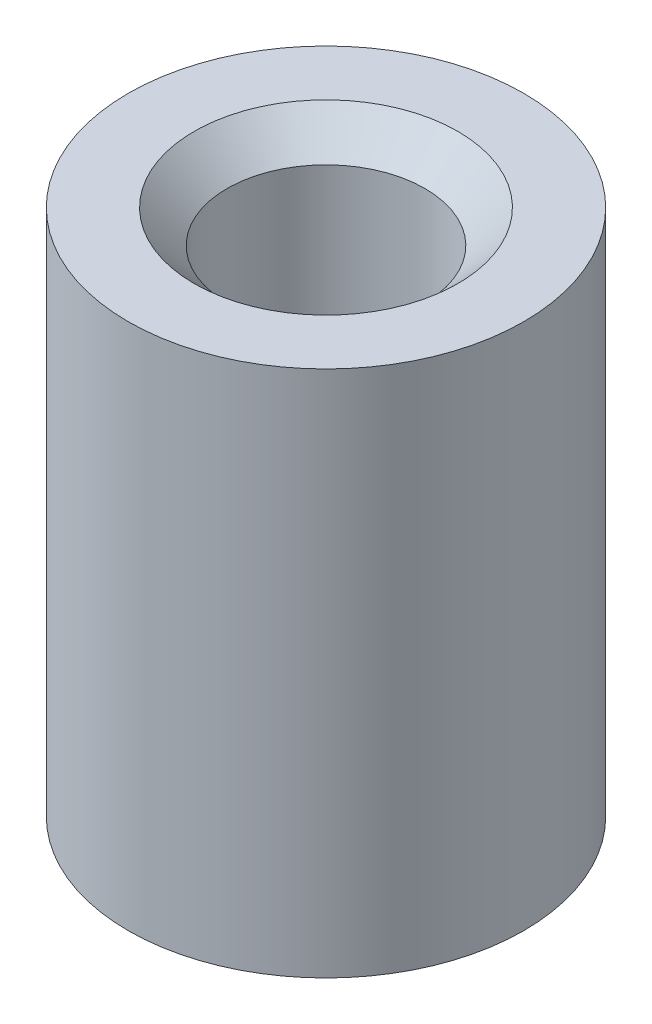
ISO-10303-21;
HEADER;
FILE_DESCRIPTION(('STEP AP214'),'2;1');
FILE_NAME('part.step','',(''),(''),'','','');
FILE_SCHEMA(('AUTOMOTIVE_DESIGN { 1 0 10303 214 1 1 1 1 }'));
ENDSEC;
DATA;
#1=APPLICATION_CONTEXT('core data for automotive mechanical design processes');
#2=APPLICATION_PROTOCOL_DEFINITION('international standard','automotive_design',2000,#1);
#3=PRODUCT_CONTEXT('',#1,'mechanical');
#4=PRODUCT('Part','Part','',(#3));
#5=PRODUCT_RELATED_PRODUCT_CATEGORY('part','',(#4));
#6=PRODUCT_DEFINITION_FORMATION('','',#4);
#7=PRODUCT_DEFINITION_CONTEXT('part definition',#1,'design');
#8=PRODUCT_DEFINITION('design','',#6,#7);
#9=PRODUCT_DEFINITION_SHAPE('','',#8);
#10=(LENGTH_UNIT() NAMED_UNIT(*) SI_UNIT(.MILLI.,.METRE.));
#11=(NAMED_UNIT(*) PLANE_ANGLE_UNIT() SI_UNIT($,.RADIAN.));
#12=(NAMED_UNIT(*) SI_UNIT($,.STERADIAN.) SOLID_ANGLE_UNIT());
#13=UNCERTAINTY_MEASURE_WITH_UNIT(LENGTH_MEASURE(1.E-05),#10,'distance_accuracy_value','');
#14=(GEOMETRIC_REPRESENTATION_CONTEXT(3) GLOBAL_UNCERTAINTY_ASSIGNED_CONTEXT((#13)) GLOBAL_UNIT_ASSIGNED_CONTEXT((#10,
#11,#12)) REPRESENTATION_CONTEXT('',''));
#15=CARTESIAN_POINT('',(0.,0.,0.));
#16=DIRECTION('',(0.,0.,1.));
#17=DIRECTION('',(1.,0.,0.));
#18=AXIS2_PLACEMENT_3D('',#15,#16,#17);
#19=CARTESIAN_POINT('',(0.,16.,0.));
#20=DIRECTION('',(0.,-1.,0.));
#21=DIRECTION('',(0.,0.,-1.));
#22=AXIS2_PLACEMENT_3D('',#19,#20,#21);
#23=PLANE('',#22);
#24=CARTESIAN_POINT('',(0.,16.,0.));
#25=DIRECTION('',(0.,-1.,0.));
#26=DIRECTION('',(0.,0.,-1.));
#27=AXIS2_PLACEMENT_3D('',#24,#25,#26);
#28=CIRCLE('',#27,4.);
#29=CARTESIAN_POINT('',(0.,16.,-4.));
#30=VERTEX_POINT('',#29);
#31=EDGE_CURVE('E54',#30,#30,#28,.T.);
#32=ORIENTED_EDGE('',*,*,#31,.T.);
#33=EDGE_LOOP('',(#32));
#34=FACE_BOUND('',#33,.T.);
#35=CARTESIAN_POINT('',(0.,16.,0.));
#36=DIRECTION('',(0.,-1.,0.));
#37=DIRECTION('',(0.,0.,-1.));
#38=AXIS2_PLACEMENT_3D('',#35,#36,#37);
#39=CIRCLE('',#38,6.);
#40=CARTESIAN_POINT('',(0.,16.,-6.));
#41=VERTEX_POINT('',#40);
#42=EDGE_CURVE('E70',#41,#41,#39,.T.);
#43=ORIENTED_EDGE('',*,*,#42,.F.);
#44=EDGE_LOOP('',(#43));
#45=FACE_BOUND('',#44,.T.);
#46=ADVANCED_FACE('F45',(#34,#45),#23,.F.);
#47=CARTESIAN_POINT('',(0.,0.,0.));
#48=DIRECTION('',(0.,-1.,0.));
#49=DIRECTION('',(0.,0.,-1.));
#50=AXIS2_PLACEMENT_3D('',#47,#48,#49);
#51=CYLINDRICAL_SURFACE('',#50,3.);
#52=CARTESIAN_POINT('',(0.,15.,0.));
#53=DIRECTION('',(0.,-1.,0.));
#54=DIRECTION('',(0.,0.,-1.));
#55=AXIS2_PLACEMENT_3D('',#52,#53,#54);
#56=CIRCLE('',#55,3.);
#57=CARTESIAN_POINT('',(0.,15.,-3.));
#58=VERTEX_POINT('',#57);
#59=EDGE_CURVE('E10',#58,#58,#56,.F.);
#60=ORIENTED_EDGE('',*,*,#59,.T.);
#61=EDGE_LOOP('',(#60));
#62=FACE_BOUND('',#61,.T.);
#63=CARTESIAN_POINT('',(0.,0.,0.));
#64=DIRECTION('',(0.,-1.,0.));
#65=DIRECTION('',(0.,0.,-1.));
#66=AXIS2_PLACEMENT_3D('',#63,#64,#65);
#67=CIRCLE('',#66,3.);
#68=CARTESIAN_POINT('',(0.,0.,-3.));
#69=VERTEX_POINT('',#68);
#70=EDGE_CURVE('E59',#69,#69,#67,.T.);
#71=ORIENTED_EDGE('',*,*,#70,.T.);
#72=EDGE_LOOP('',(#71));
#73=FACE_BOUND('',#72,.T.);
#74=ADVANCED_FACE('F78',(#62,#73),#51,.F.);
#75=CARTESIAN_POINT('',(0.,0.,0.));
#76=DIRECTION('',(0.,1.,0.));
#77=DIRECTION('',(0.,0.,1.));
#78=AXIS2_PLACEMENT_3D('',#75,#76,#77);
#79=PLANE('',#78);
#80=ORIENTED_EDGE('',*,*,#70,.F.);
#81=EDGE_LOOP('',(#80));
#82=FACE_BOUND('',#81,.T.);
#83=CARTESIAN_POINT('',(0.,0.,0.));
#84=DIRECTION('',(0.,-1.,0.));
#85=DIRECTION('',(0.,0.,-1.));
#86=AXIS2_PLACEMENT_3D('',#83,#84,#85);
#87=CIRCLE('',#86,6.);
#88=CARTESIAN_POINT('',(0.,0.,-6.));
#89=VERTEX_POINT('',#88);
#90=EDGE_CURVE('E64',#89,#89,#87,.T.);
#91=ORIENTED_EDGE('',*,*,#90,.T.);
#92=EDGE_LOOP('',(#91));
#93=FACE_BOUND('',#92,.T.);
#94=ADVANCED_FACE('F83',(#82,#93),#79,.F.);
#95=CARTESIAN_POINT('',(0.,0.,0.));
#96=DIRECTION('',(0.,-1.,0.));
#97=DIRECTION('',(0.,0.,-1.));
#98=AXIS2_PLACEMENT_3D('',#95,#96,#97);
#99=CYLINDRICAL_SURFACE('',#98,6.);
#100=ORIENTED_EDGE('',*,*,#90,.F.);
#101=EDGE_LOOP('',(#100));
#102=FACE_BOUND('',#101,.T.);
#103=ORIENTED_EDGE('',*,*,#42,.T.);
#104=EDGE_LOOP('',(#103));
#105=FACE_BOUND('',#104,.T.);
#106=ADVANCED_FACE('F75',(#102,#105),#99,.T.);
#107=CARTESIAN_POINT('',(0.,16.,0.));
#108=DIRECTION('',(0.,1.,0.));
#109=DIRECTION('',(0.,0.,1.));
#110=AXIS2_PLACEMENT_3D('',#107,#108,#109);
#111=CONICAL_SURFACE('',#110,4.,0.785398163397447);
#112=ORIENTED_EDGE('',*,*,#59,.F.);
#113=EDGE_LOOP('',(#112));
#114=FACE_BOUND('',#113,.T.);
#115=ORIENTED_EDGE('',*,*,#31,.F.);
#116=EDGE_LOOP('',(#115));
#117=FACE_BOUND('',#116,.T.);
#118=ADVANCED_FACE('F48',(#114,#117),#111,.F.);
#119=CLOSED_SHELL('',(#46,#74,#94,#106,#118));
#120=MANIFOLD_SOLID_BREP('B2',#119);
#121=ADVANCED_BREP_SHAPE_REPRESENTATION('',(#18,#120),#14);
#122=SHAPE_DEFINITION_REPRESENTATION(#9,#121);
ENDSEC;
END-ISO-10303-21;
